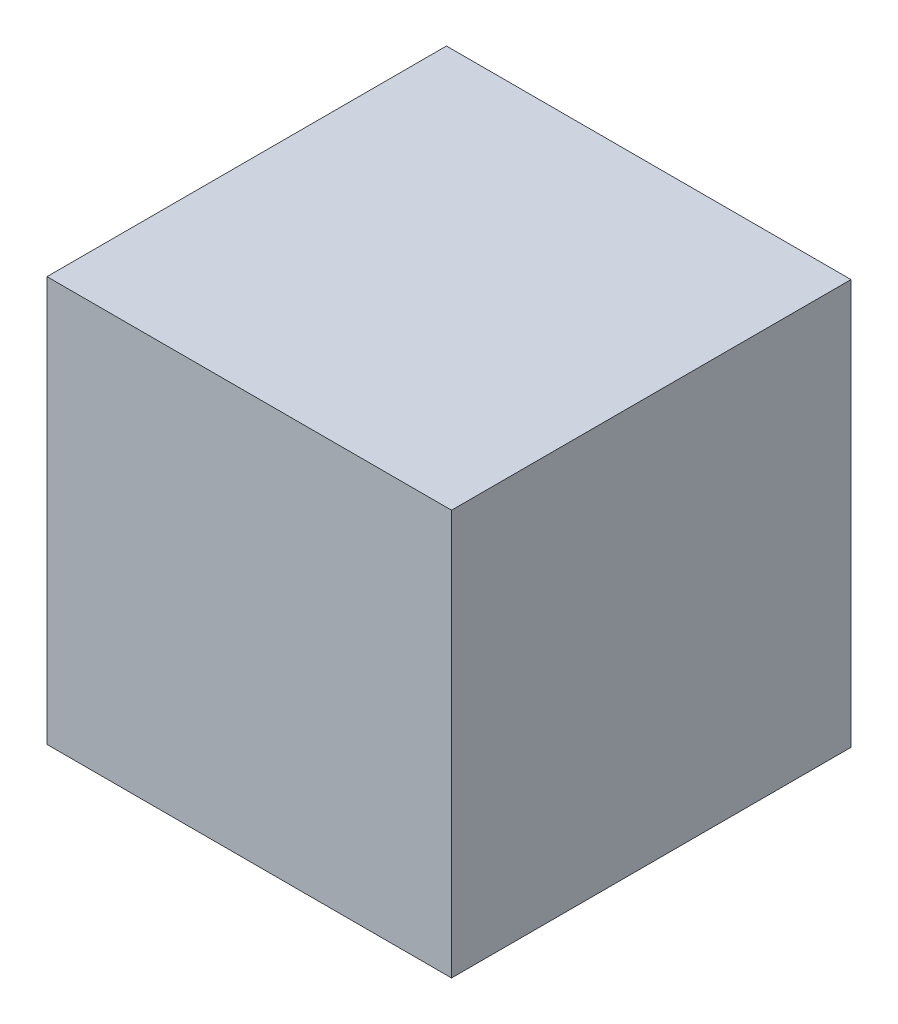
ISO-10303-21;
HEADER;
FILE_DESCRIPTION(('STEP AP214'),'2;1');
FILE_NAME('part.step','',(''),(''),'','','');
FILE_SCHEMA(('AUTOMOTIVE_DESIGN { 1 0 10303 214 1 1 1 1 }'));
ENDSEC;
DATA;
#1=APPLICATION_CONTEXT('core data for automotive mechanical design processes');
#2=APPLICATION_PROTOCOL_DEFINITION('international standard','automotive_design',2000,#1);
#3=PRODUCT_CONTEXT('',#1,'mechanical');
#4=PRODUCT('Part','Part','',(#3));
#5=PRODUCT_RELATED_PRODUCT_CATEGORY('part','',(#4));
#6=PRODUCT_DEFINITION_FORMATION('','',#4);
#7=PRODUCT_DEFINITION_CONTEXT('part definition',#1,'design');
#8=PRODUCT_DEFINITION('design','',#6,#7);
#9=PRODUCT_DEFINITION_SHAPE('','',#8);
#10=(LENGTH_UNIT() NAMED_UNIT(*) SI_UNIT(.MILLI.,.METRE.));
#11=(NAMED_UNIT(*) PLANE_ANGLE_UNIT() SI_UNIT($,.RADIAN.));
#12=(NAMED_UNIT(*) SI_UNIT($,.STERADIAN.) SOLID_ANGLE_UNIT());
#13=UNCERTAINTY_MEASURE_WITH_UNIT(LENGTH_MEASURE(1.E-05),#10,'distance_accuracy_value','');
#14=(GEOMETRIC_REPRESENTATION_CONTEXT(3) GLOBAL_UNCERTAINTY_ASSIGNED_CONTEXT((#13)) GLOBAL_UNIT_ASSIGNED_CONTEXT((#10,
#11,#12)) REPRESENTATION_CONTEXT('',''));
#15=CARTESIAN_POINT('',(0.,0.,0.));
#16=DIRECTION('',(0.,0.,1.));
#17=DIRECTION('',(1.,0.,0.));
#18=AXIS2_PLACEMENT_3D('',#15,#16,#17);
#19=CARTESIAN_POINT('',(-84.8977360560048,48.4409454061252,96.52));
#20=DIRECTION('',(1.,0.,0.));
#21=DIRECTION('',(0.,0.,-1.));
#22=AXIS2_PLACEMENT_3D('',#19,#20,#21);
#23=PLANE('',#22);
#24=DIRECTION('',(0.,-1.,0.));
#25=VECTOR('',#24,1.);
#26=CARTESIAN_POINT('',(-84.8977360560048,48.4409454061252,0.));
#27=LINE('',#26,#25);
#28=CARTESIAN_POINT('',(-84.8977360560048,48.4409454061252,0.));
#29=VERTEX_POINT('',#28);
#30=CARTESIAN_POINT('',(-84.8977360560048,-49.447137150466,0.));
#31=VERTEX_POINT('',#30);
#32=EDGE_CURVE('E111',#29,#31,#27,.T.);
#33=ORIENTED_EDGE('',*,*,#32,.T.);
#34=DIRECTION('',(0.,0.,-1.));
#35=VECTOR('',#34,1.);
#36=CARTESIAN_POINT('',(-84.8977360560048,-49.447137150466,96.52));
#37=LINE('',#36,#35);
#38=CARTESIAN_POINT('',(-84.8977360560048,-49.447137150466,96.52));
#39=VERTEX_POINT('',#38);
#40=EDGE_CURVE('E11',#39,#31,#37,.T.);
#41=ORIENTED_EDGE('',*,*,#40,.F.);
#42=DIRECTION('',(0.,-1.,0.));
#43=VECTOR('',#42,1.);
#44=CARTESIAN_POINT('',(-84.8977360560048,48.4409454061252,96.52));
#45=LINE('',#44,#43);
#46=CARTESIAN_POINT('',(-84.8977360560048,48.4409454061252,96.52));
#47=VERTEX_POINT('',#46);
#48=EDGE_CURVE('E100',#47,#39,#45,.T.);
#49=ORIENTED_EDGE('',*,*,#48,.F.);
#50=DIRECTION('',(0.,0.,-1.));
#51=VECTOR('',#50,1.);
#52=CARTESIAN_POINT('',(-84.8977360560048,48.4409454061252,96.52));
#53=LINE('',#52,#51);
#54=EDGE_CURVE('E108',#47,#29,#53,.T.);
#55=ORIENTED_EDGE('',*,*,#54,.T.);
#56=EDGE_LOOP('',(#33,#41,#49,#55));
#57=FACE_BOUND('',#56,.T.);
#58=ADVANCED_FACE('F44',(#57),#23,.F.);
#59=CARTESIAN_POINT('',(-84.8977360560048,-49.447137150466,96.52));
#60=DIRECTION('',(0.,1.,0.));
#61=DIRECTION('',(0.,0.,1.));
#62=AXIS2_PLACEMENT_3D('',#59,#60,#61);
#63=PLANE('',#62);
#64=DIRECTION('',(1.,0.,0.));
#65=VECTOR('',#64,1.);
#66=CARTESIAN_POINT('',(-84.8977360560048,-49.447137150466,0.));
#67=LINE('',#66,#65);
#68=CARTESIAN_POINT('',(12.8466048228234,-49.447137150466,0.));
#69=VERTEX_POINT('',#68);
#70=EDGE_CURVE('E105',#31,#69,#67,.T.);
#71=ORIENTED_EDGE('',*,*,#70,.T.);
#72=DIRECTION('',(0.,0.,-1.));
#73=VECTOR('',#72,1.);
#74=CARTESIAN_POINT('',(12.8466048228234,-49.447137150466,96.52));
#75=LINE('',#74,#73);
#76=CARTESIAN_POINT('',(12.8466048228234,-49.447137150466,96.52));
#77=VERTEX_POINT('',#76);
#78=EDGE_CURVE('E53',#77,#69,#75,.T.);
#79=ORIENTED_EDGE('',*,*,#78,.F.);
#80=DIRECTION('',(1.,0.,0.));
#81=VECTOR('',#80,1.);
#82=CARTESIAN_POINT('',(-84.8977360560048,-49.447137150466,96.52));
#83=LINE('',#82,#81);
#84=EDGE_CURVE('E95',#39,#77,#83,.T.);
#85=ORIENTED_EDGE('',*,*,#84,.F.);
#86=ORIENTED_EDGE('',*,*,#40,.T.);
#87=EDGE_LOOP('',(#71,#79,#85,#86));
#88=FACE_BOUND('',#87,.T.);
#89=ADVANCED_FACE('F102',(#88),#63,.F.);
#90=CARTESIAN_POINT('',(12.8466048228234,48.4409454061252,96.52));
#91=DIRECTION('',(-1.,0.,0.));
#92=DIRECTION('',(0.,0.,1.));
#93=AXIS2_PLACEMENT_3D('',#90,#91,#92);
#94=PLANE('',#93);
#95=DIRECTION('',(0.,1.,0.));
#96=VECTOR('',#95,1.);
#97=CARTESIAN_POINT('',(12.8466048228234,48.4409454061252,0.));
#98=LINE('',#97,#96);
#99=CARTESIAN_POINT('',(12.8466048228234,48.4409454061252,0.));
#100=VERTEX_POINT('',#99);
#101=EDGE_CURVE('E80',#69,#100,#98,.T.);
#102=ORIENTED_EDGE('',*,*,#101,.T.);
#103=DIRECTION('',(0.,0.,-1.));
#104=VECTOR('',#103,1.);
#105=CARTESIAN_POINT('',(12.8466048228234,48.4409454061252,96.52));
#106=LINE('',#105,#104);
#107=CARTESIAN_POINT('',(12.8466048228234,48.4409454061252,96.52));
#108=VERTEX_POINT('',#107);
#109=EDGE_CURVE('E101',#108,#100,#106,.T.);
#110=ORIENTED_EDGE('',*,*,#109,.F.);
#111=DIRECTION('',(0.,1.,0.));
#112=VECTOR('',#111,1.);
#113=CARTESIAN_POINT('',(12.8466048228234,48.4409454061252,96.52));
#114=LINE('',#113,#112);
#115=EDGE_CURVE('E94',#77,#108,#114,.T.);
#116=ORIENTED_EDGE('',*,*,#115,.F.);
#117=ORIENTED_EDGE('',*,*,#78,.T.);
#118=EDGE_LOOP('',(#102,#110,#116,#117));
#119=FACE_BOUND('',#118,.T.);
#120=ADVANCED_FACE('F103',(#119),#94,.F.);
#121=CARTESIAN_POINT('',(-84.8977360560048,48.4409454061252,96.52));
#122=DIRECTION('',(0.,-1.,0.));
#123=DIRECTION('',(0.,0.,-1.));
#124=AXIS2_PLACEMENT_3D('',#121,#122,#123);
#125=PLANE('',#124);
#126=DIRECTION('',(-1.,0.,0.));
#127=VECTOR('',#126,1.);
#128=CARTESIAN_POINT('',(-84.8977360560048,48.4409454061252,0.));
#129=LINE('',#128,#127);
#130=EDGE_CURVE('E82',#100,#29,#129,.T.);
#131=ORIENTED_EDGE('',*,*,#130,.T.);
#132=ORIENTED_EDGE('',*,*,#54,.F.);
#133=DIRECTION('',(-1.,0.,0.));
#134=VECTOR('',#133,1.);
#135=CARTESIAN_POINT('',(-84.8977360560048,48.4409454061252,96.52));
#136=LINE('',#135,#134);
#137=EDGE_CURVE('E62',#108,#47,#136,.T.);
#138=ORIENTED_EDGE('',*,*,#137,.F.);
#139=ORIENTED_EDGE('',*,*,#109,.T.);
#140=EDGE_LOOP('',(#131,#132,#138,#139));
#141=FACE_BOUND('',#140,.T.);
#142=ADVANCED_FACE('F128',(#141),#125,.F.);
#143=CARTESIAN_POINT('',(0.,0.,96.52));
#144=DIRECTION('',(0.,0.,1.));
#145=DIRECTION('',(1.,0.,0.));
#146=AXIS2_PLACEMENT_3D('',#143,#144,#145);
#147=PLANE('',#146);
#148=ORIENTED_EDGE('',*,*,#48,.T.);
#149=ORIENTED_EDGE('',*,*,#84,.T.);
#150=ORIENTED_EDGE('',*,*,#115,.T.);
#151=ORIENTED_EDGE('',*,*,#137,.T.);
#152=EDGE_LOOP('',(#148,#149,#150,#151));
#153=FACE_BOUND('',#152,.T.);
#154=ADVANCED_FACE('F93',(#153),#147,.T.);
#155=CARTESIAN_POINT('',(0.,0.,0.));
#156=DIRECTION('',(0.,0.,1.));
#157=DIRECTION('',(1.,0.,0.));
#158=AXIS2_PLACEMENT_3D('',#155,#156,#157);
#159=PLANE('',#158);
#160=ORIENTED_EDGE('',*,*,#32,.F.);
#161=ORIENTED_EDGE('',*,*,#130,.F.);
#162=ORIENTED_EDGE('',*,*,#101,.F.);
#163=ORIENTED_EDGE('',*,*,#70,.F.);
#164=EDGE_LOOP('',(#160,#161,#162,#163));
#165=FACE_BOUND('',#164,.T.);
#166=ADVANCED_FACE('F129',(#165),#159,.F.);
#167=CLOSED_SHELL('',(#58,#89,#120,#142,#154,#166));
#168=MANIFOLD_SOLID_BREP('B2',#167);
#169=ADVANCED_BREP_SHAPE_REPRESENTATION('',(#18,#168),#14);
#170=SHAPE_DEFINITION_REPRESENTATION(#9,#169);
ENDSEC;
END-ISO-10303-21;
